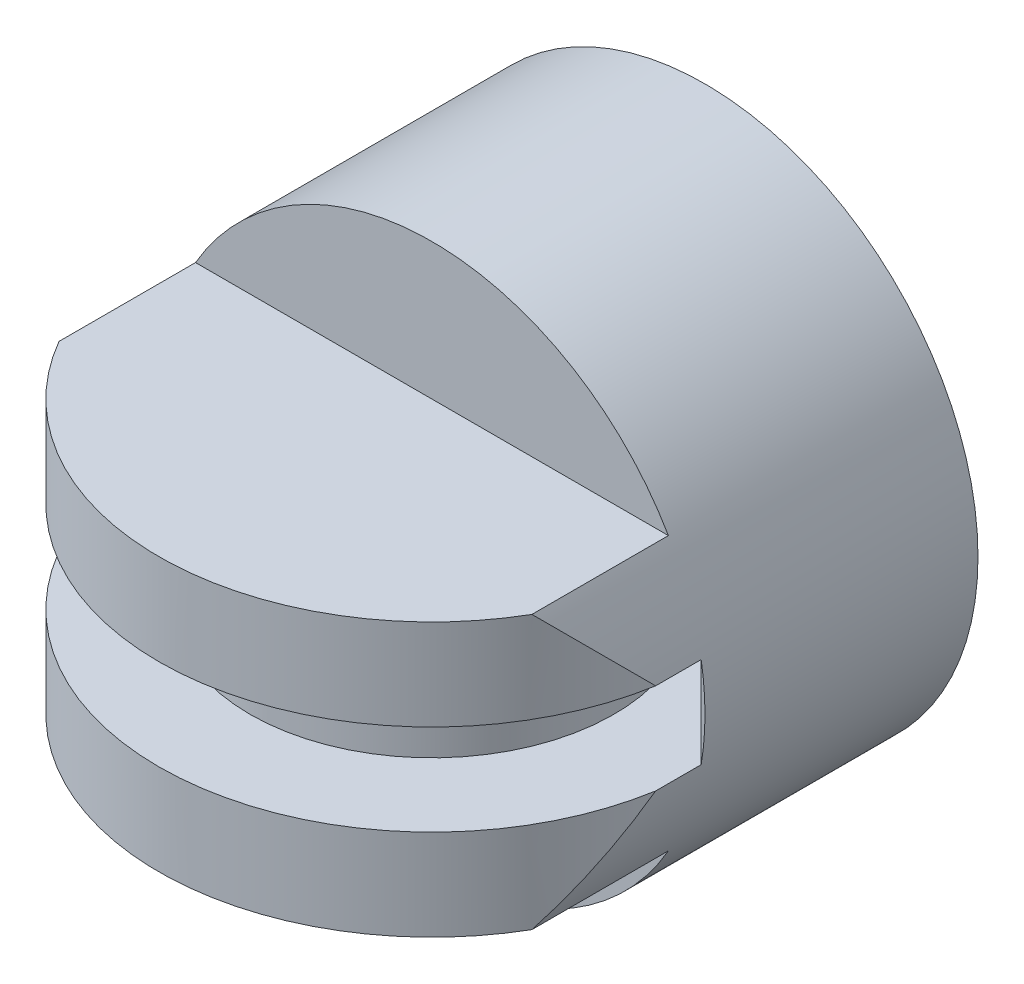
ISO-10303-21;
HEADER;
FILE_DESCRIPTION(('STEP AP214'),'2;1');
FILE_NAME('part.step','',(''),(''),'','','');
FILE_SCHEMA(('AUTOMOTIVE_DESIGN { 1 0 10303 214 1 1 1 1 }'));
ENDSEC;
DATA;
#1=APPLICATION_CONTEXT('core data for automotive mechanical design processes');
#2=APPLICATION_PROTOCOL_DEFINITION('international standard','automotive_design',2000,#1);
#3=PRODUCT_CONTEXT('',#1,'mechanical');
#4=PRODUCT('Part','Part','',(#3));
#5=PRODUCT_RELATED_PRODUCT_CATEGORY('part','',(#4));
#6=PRODUCT_DEFINITION_FORMATION('','',#4);
#7=PRODUCT_DEFINITION_CONTEXT('part definition',#1,'design');
#8=PRODUCT_DEFINITION('design','',#6,#7);
#9=PRODUCT_DEFINITION_SHAPE('','',#8);
#10=(LENGTH_UNIT() NAMED_UNIT(*) SI_UNIT(.MILLI.,.METRE.));
#11=(NAMED_UNIT(*) PLANE_ANGLE_UNIT() SI_UNIT($,.RADIAN.));
#12=(NAMED_UNIT(*) SI_UNIT($,.STERADIAN.) SOLID_ANGLE_UNIT());
#13=UNCERTAINTY_MEASURE_WITH_UNIT(LENGTH_MEASURE(1.E-05),#10,'distance_accuracy_value','');
#14=(GEOMETRIC_REPRESENTATION_CONTEXT(3) GLOBAL_UNCERTAINTY_ASSIGNED_CONTEXT((#13)) GLOBAL_UNIT_ASSIGNED_CONTEXT((#10,
#11,#12)) REPRESENTATION_CONTEXT('',''));
#15=CARTESIAN_POINT('',(0.,0.,0.));
#16=DIRECTION('',(0.,0.,1.));
#17=DIRECTION('',(1.,0.,0.));
#18=AXIS2_PLACEMENT_3D('',#15,#16,#17);
#19=CARTESIAN_POINT('',(0.,5.,0.));
#20=DIRECTION('',(0.,0.,1.));
#21=DIRECTION('',(1.,0.,0.));
#22=AXIS2_PLACEMENT_3D('',#19,#20,#21);
#23=PLANE('',#22);
#24=CARTESIAN_POINT('',(0.,5.,0.));
#25=DIRECTION('',(0.,0.,1.));
#26=DIRECTION('',(1.,0.,0.));
#27=AXIS2_PLACEMENT_3D('',#24,#25,#26);
#28=CIRCLE('',#27,30.);
#29=CARTESIAN_POINT('',(29.5803989154981,0.,0.));
#30=VERTEX_POINT('',#29);
#31=CARTESIAN_POINT('',(29.5803989154981,10.,0.));
#32=VERTEX_POINT('',#31);
#33=EDGE_CURVE('E129',#30,#32,#28,.T.);
#34=ORIENTED_EDGE('',*,*,#33,.T.);
#35=DIRECTION('',(0.,-1.,0.));
#36=VECTOR('',#35,1.);
#37=CARTESIAN_POINT('',(29.5803989154981,0.,0.));
#38=LINE('',#37,#36);
#39=EDGE_CURVE('E118',#32,#30,#38,.T.);
#40=ORIENTED_EDGE('',*,*,#39,.T.);
#41=EDGE_LOOP('',(#34,#40));
#42=FACE_BOUND('',#41,.T.);
#43=ADVANCED_FACE('F39',(#42),#23,.T.);
#44=CARTESIAN_POINT('',(-29.5803989154981,10.,2.06558821617994E-13));
#45=VERTEX_POINT('',#44);
#46=CARTESIAN_POINT('',(-29.5803989154981,0.,2.06558821617994E-13));
#47=VERTEX_POINT('',#46);
#48=EDGE_CURVE('E142',#45,#47,#28,.T.);
#49=ORIENTED_EDGE('',*,*,#48,.T.);
#50=DIRECTION('',(0.,-1.,0.));
#51=VECTOR('',#50,1.);
#52=CARTESIAN_POINT('',(-29.5803989154981,0.,2.06558821617994E-13));
#53=LINE('',#52,#51);
#54=EDGE_CURVE('E124',#45,#47,#53,.T.);
#55=ORIENTED_EDGE('',*,*,#54,.F.);
#56=EDGE_LOOP('',(#49,#55));
#57=FACE_BOUND('',#56,.T.);
#58=ADVANCED_FACE('F159',(#57),#23,.T.);
#59=CARTESIAN_POINT('',(0.,20.,0.));
#60=DIRECTION('',(0.,-1.,0.));
#61=DIRECTION('',(0.,0.,-1.));
#62=AXIS2_PLACEMENT_3D('',#59,#60,#61);
#63=CYLINDRICAL_SURFACE('',#62,30.);
#64=CARTESIAN_POINT('',(0.,5.,0.));
#65=DIRECTION('',(0.,-0.707106781186547,0.707106781186547));
#66=DIRECTION('',(0.,-0.707106781186547,-0.707106781186547));
#67=AXIS2_PLACEMENT_3D('',#64,#65,#66);
#68=ELLIPSE('',#67,42.4264068711928,30.);
#69=CARTESIAN_POINT('',(-29.5803989154981,10.,5.));
#70=VERTEX_POINT('',#69);
#71=CARTESIAN_POINT('',(-25.9807621135332,20.,15.));
#72=VERTEX_POINT('',#71);
#73=EDGE_CURVE('E59',#70,#72,#68,.F.);
#74=ORIENTED_EDGE('',*,*,#73,.F.);
#75=CARTESIAN_POINT('',(0.,10.,0.));
#76=DIRECTION('',(0.,1.,0.));
#77=DIRECTION('',(0.,0.,1.));
#78=AXIS2_PLACEMENT_3D('',#75,#76,#77);
#79=CIRCLE('',#78,30.);
#80=CARTESIAN_POINT('',(29.5803989154981,10.,5.));
#81=VERTEX_POINT('',#80);
#82=EDGE_CURVE('E176',#70,#81,#79,.T.);
#83=ORIENTED_EDGE('',*,*,#82,.T.);
#84=CARTESIAN_POINT('',(25.9807621135332,20.,15.));
#85=VERTEX_POINT('',#84);
#86=EDGE_CURVE('E131',#85,#81,#68,.F.);
#87=ORIENTED_EDGE('',*,*,#86,.F.);
#88=CARTESIAN_POINT('',(0.,20.,0.));
#89=DIRECTION('',(0.,1.,0.));
#90=DIRECTION('',(0.,0.,1.));
#91=AXIS2_PLACEMENT_3D('',#88,#89,#90);
#92=CIRCLE('',#91,30.);
#93=EDGE_CURVE('E170',#72,#85,#92,.T.);
#94=ORIENTED_EDGE('',*,*,#93,.F.);
#95=EDGE_LOOP('',(#74,#83,#87,#94));
#96=FACE_BOUND('',#95,.T.);
#97=ADVANCED_FACE('F223',(#96),#63,.T.);
#98=CARTESIAN_POINT('',(0.,20.,0.));
#99=DIRECTION('',(0.,1.,0.));
#100=DIRECTION('',(0.,0.,1.));
#101=AXIS2_PLACEMENT_3D('',#98,#99,#100);
#102=PLANE('',#101);
#103=DIRECTION('',(1.,0.,0.));
#104=VECTOR('',#103,1.);
#105=CARTESIAN_POINT('',(0.,20.,0.));
#106=LINE('',#105,#104);
#107=CARTESIAN_POINT('',(-25.9807621135332,20.,0.));
#108=VERTEX_POINT('',#107);
#109=CARTESIAN_POINT('',(25.9807621135332,20.,0.));
#110=VERTEX_POINT('',#109);
#111=EDGE_CURVE('E187',#108,#110,#106,.T.);
#112=ORIENTED_EDGE('',*,*,#111,.F.);
#113=DIRECTION('',(0.,0.,1.));
#114=VECTOR('',#113,1.);
#115=CARTESIAN_POINT('',(-25.9807621135332,20.,-30.));
#116=LINE('',#115,#114);
#117=EDGE_CURVE('E216',#108,#72,#116,.T.);
#118=ORIENTED_EDGE('',*,*,#117,.T.);
#119=ORIENTED_EDGE('',*,*,#93,.T.);
#120=DIRECTION('',(0.,0.,1.));
#121=VECTOR('',#120,1.);
#122=CARTESIAN_POINT('',(25.9807621135332,20.,-30.));
#123=LINE('',#122,#121);
#124=EDGE_CURVE('E213',#85,#110,#123,.F.);
#125=ORIENTED_EDGE('',*,*,#124,.T.);
#126=EDGE_LOOP('',(#112,#118,#119,#125));
#127=FACE_BOUND('',#126,.T.);
#128=ADVANCED_FACE('F221',(#127),#102,.T.);
#129=CARTESIAN_POINT('',(0.,10.,0.));
#130=DIRECTION('',(0.,1.,0.));
#131=DIRECTION('',(0.,0.,1.));
#132=AXIS2_PLACEMENT_3D('',#129,#130,#131);
#133=PLANE('',#132);
#134=CARTESIAN_POINT('',(0.,10.,0.));
#135=DIRECTION('',(0.,-1.,0.));
#136=DIRECTION('',(0.,0.,-1.));
#137=AXIS2_PLACEMENT_3D('',#134,#135,#136);
#138=CIRCLE('',#137,29.5803989154981);
#139=EDGE_CURVE('E102',#45,#32,#138,.T.);
#140=ORIENTED_EDGE('',*,*,#139,.T.);
#141=DIRECTION('',(0.,0.,1.));
#142=VECTOR('',#141,1.);
#143=CARTESIAN_POINT('',(29.5803989154981,10.,-30.));
#144=LINE('',#143,#142);
#145=EDGE_CURVE('E108',#81,#32,#144,.F.);
#146=ORIENTED_EDGE('',*,*,#145,.F.);
#147=ORIENTED_EDGE('',*,*,#82,.F.);
#148=DIRECTION('',(0.,0.,1.));
#149=VECTOR('',#148,1.);
#150=CARTESIAN_POINT('',(-29.5803989154981,10.,-30.));
#151=LINE('',#150,#149);
#152=EDGE_CURVE('E55',#45,#70,#151,.T.);
#153=ORIENTED_EDGE('',*,*,#152,.F.);
#154=EDGE_LOOP('',(#140,#146,#147,#153));
#155=FACE_BOUND('',#154,.T.);
#156=CARTESIAN_POINT('',(0.,10.,0.));
#157=DIRECTION('',(0.,1.,0.));
#158=DIRECTION('',(0.,0.,1.));
#159=AXIS2_PLACEMENT_3D('',#156,#157,#158);
#160=CIRCLE('',#159,20.);
#161=CARTESIAN_POINT('',(0.,10.,20.));
#162=VERTEX_POINT('',#161);
#163=EDGE_CURVE('E167',#162,#162,#160,.T.);
#164=ORIENTED_EDGE('',*,*,#163,.T.);
#165=EDGE_LOOP('',(#164));
#166=FACE_BOUND('',#165,.T.);
#167=ADVANCED_FACE('F104',(#155,#166),#133,.F.);
#168=CARTESIAN_POINT('',(0.,-10.,0.));
#169=DIRECTION('',(0.,1.,0.));
#170=DIRECTION('',(0.,0.,1.));
#171=AXIS2_PLACEMENT_3D('',#168,#169,#170);
#172=CYLINDRICAL_SURFACE('',#171,30.);
#173=CARTESIAN_POINT('',(0.,5.,0.));
#174=DIRECTION('',(0.,0.707106781186547,0.707106781186547));
#175=DIRECTION('',(0.,0.707106781186547,-0.707106781186547));
#176=AXIS2_PLACEMENT_3D('',#173,#174,#175);
#177=ELLIPSE('',#176,42.4264068711928,30.);
#178=CARTESIAN_POINT('',(29.5803989154981,0.,5.));
#179=VERTEX_POINT('',#178);
#180=CARTESIAN_POINT('',(25.9807621135332,-10.,15.));
#181=VERTEX_POINT('',#180);
#182=EDGE_CURVE('E133',#179,#181,#177,.F.);
#183=ORIENTED_EDGE('',*,*,#182,.F.);
#184=CARTESIAN_POINT('',(0.,0.,0.));
#185=DIRECTION('',(0.,-1.,0.));
#186=DIRECTION('',(0.,0.,-1.));
#187=AXIS2_PLACEMENT_3D('',#184,#185,#186);
#188=CIRCLE('',#187,30.);
#189=CARTESIAN_POINT('',(-29.5803989154981,0.,5.));
#190=VERTEX_POINT('',#189);
#191=EDGE_CURVE('E184',#179,#190,#188,.T.);
#192=ORIENTED_EDGE('',*,*,#191,.T.);
#193=CARTESIAN_POINT('',(-25.9807621135332,-10.,15.));
#194=VERTEX_POINT('',#193);
#195=EDGE_CURVE('E114',#194,#190,#177,.F.);
#196=ORIENTED_EDGE('',*,*,#195,.F.);
#197=CARTESIAN_POINT('',(0.,-10.,0.));
#198=DIRECTION('',(0.,-1.,0.));
#199=DIRECTION('',(0.,0.,-1.));
#200=AXIS2_PLACEMENT_3D('',#197,#198,#199);
#201=CIRCLE('',#200,30.);
#202=EDGE_CURVE('E177',#181,#194,#201,.T.);
#203=ORIENTED_EDGE('',*,*,#202,.F.);
#204=EDGE_LOOP('',(#183,#192,#196,#203));
#205=FACE_BOUND('',#204,.T.);
#206=ADVANCED_FACE('F258',(#205),#172,.T.);
#207=CARTESIAN_POINT('',(0.,-10.,0.));
#208=DIRECTION('',(0.,-1.,0.));
#209=DIRECTION('',(0.,0.,-1.));
#210=AXIS2_PLACEMENT_3D('',#207,#208,#209);
#211=PLANE('',#210);
#212=DIRECTION('',(-1.,0.,0.));
#213=VECTOR('',#212,1.);
#214=CARTESIAN_POINT('',(0.,-10.,0.));
#215=LINE('',#214,#213);
#216=CARTESIAN_POINT('',(25.9807621135332,-10.,0.));
#217=VERTEX_POINT('',#216);
#218=CARTESIAN_POINT('',(-25.9807621135332,-10.,0.));
#219=VERTEX_POINT('',#218);
#220=EDGE_CURVE('E156',#217,#219,#215,.T.);
#221=ORIENTED_EDGE('',*,*,#220,.F.);
#222=DIRECTION('',(0.,0.,1.));
#223=VECTOR('',#222,1.);
#224=CARTESIAN_POINT('',(25.9807621135332,-10.,-30.));
#225=LINE('',#224,#223);
#226=EDGE_CURVE('E201',#217,#181,#225,.T.);
#227=ORIENTED_EDGE('',*,*,#226,.T.);
#228=ORIENTED_EDGE('',*,*,#202,.T.);
#229=DIRECTION('',(0.,0.,1.));
#230=VECTOR('',#229,1.);
#231=CARTESIAN_POINT('',(-25.9807621135332,-10.,-30.));
#232=LINE('',#231,#230);
#233=EDGE_CURVE('E200',#194,#219,#232,.F.);
#234=ORIENTED_EDGE('',*,*,#233,.T.);
#235=EDGE_LOOP('',(#221,#227,#228,#234));
#236=FACE_BOUND('',#235,.T.);
#237=ADVANCED_FACE('F252',(#236),#211,.T.);
#238=CARTESIAN_POINT('',(0.,0.,0.));
#239=DIRECTION('',(0.,-1.,0.));
#240=DIRECTION('',(0.,0.,-1.));
#241=AXIS2_PLACEMENT_3D('',#238,#239,#240);
#242=PLANE('',#241);
#243=CARTESIAN_POINT('',(0.,0.,0.));
#244=DIRECTION('',(0.,1.,0.));
#245=DIRECTION('',(0.,0.,1.));
#246=AXIS2_PLACEMENT_3D('',#243,#244,#245);
#247=CIRCLE('',#246,20.);
#248=CARTESIAN_POINT('',(0.,0.,20.));
#249=VERTEX_POINT('',#248);
#250=EDGE_CURVE('E173',#249,#249,#247,.T.);
#251=ORIENTED_EDGE('',*,*,#250,.F.);
#252=EDGE_LOOP('',(#251));
#253=FACE_BOUND('',#252,.T.);
#254=DIRECTION('',(0.,0.,1.));
#255=VECTOR('',#254,1.);
#256=CARTESIAN_POINT('',(29.5803989154981,0.,-30.));
#257=LINE('',#256,#255);
#258=EDGE_CURVE('E11',#30,#179,#257,.T.);
#259=ORIENTED_EDGE('',*,*,#258,.F.);
#260=CARTESIAN_POINT('',(0.,0.,0.));
#261=DIRECTION('',(0.,-1.,0.));
#262=DIRECTION('',(0.,0.,-1.));
#263=AXIS2_PLACEMENT_3D('',#260,#261,#262);
#264=CIRCLE('',#263,29.5803989154981);
#265=EDGE_CURVE('E115',#47,#30,#264,.T.);
#266=ORIENTED_EDGE('',*,*,#265,.F.);
#267=DIRECTION('',(0.,0.,1.));
#268=VECTOR('',#267,1.);
#269=CARTESIAN_POINT('',(-29.5803989154981,0.,-30.));
#270=LINE('',#269,#268);
#271=EDGE_CURVE('E48',#190,#47,#270,.F.);
#272=ORIENTED_EDGE('',*,*,#271,.F.);
#273=ORIENTED_EDGE('',*,*,#191,.F.);
#274=EDGE_LOOP('',(#259,#266,#272,#273));
#275=FACE_BOUND('',#274,.T.);
#276=ADVANCED_FACE('F247',(#253,#275),#242,.F.);
#277=EDGE_CURVE('E138',#110,#108,#28,.T.);
#278=ORIENTED_EDGE('',*,*,#277,.T.);
#279=ORIENTED_EDGE('',*,*,#111,.T.);
#280=EDGE_LOOP('',(#278,#279));
#281=FACE_BOUND('',#280,.T.);
#282=ADVANCED_FACE('F231',(#281),#23,.T.);
#283=CARTESIAN_POINT('',(0.,5.,-30.));
#284=DIRECTION('',(0.,0.,1.));
#285=DIRECTION('',(1.,0.,0.));
#286=AXIS2_PLACEMENT_3D('',#283,#284,#285);
#287=CYLINDRICAL_SURFACE('',#286,30.);
#288=ORIENTED_EDGE('',*,*,#117,.F.);
#289=ORIENTED_EDGE('',*,*,#277,.F.);
#290=ORIENTED_EDGE('',*,*,#124,.F.);
#291=ORIENTED_EDGE('',*,*,#86,.T.);
#292=ORIENTED_EDGE('',*,*,#145,.T.);
#293=ORIENTED_EDGE('',*,*,#33,.F.);
#294=ORIENTED_EDGE('',*,*,#258,.T.);
#295=ORIENTED_EDGE('',*,*,#182,.T.);
#296=ORIENTED_EDGE('',*,*,#226,.F.);
#297=EDGE_CURVE('E136',#219,#217,#28,.T.);
#298=ORIENTED_EDGE('',*,*,#297,.F.);
#299=ORIENTED_EDGE('',*,*,#233,.F.);
#300=ORIENTED_EDGE('',*,*,#195,.T.);
#301=ORIENTED_EDGE('',*,*,#271,.T.);
#302=ORIENTED_EDGE('',*,*,#48,.F.);
#303=ORIENTED_EDGE('',*,*,#152,.T.);
#304=ORIENTED_EDGE('',*,*,#73,.T.);
#305=EDGE_LOOP('',(#288,#289,#290,#291,#292,#293,#294,#295,#296,#298,#299,#300,#301,#302,#303,#304));
#306=FACE_BOUND('',#305,.T.);
#307=CARTESIAN_POINT('',(0.,5.,-30.));
#308=DIRECTION('',(0.,0.,1.));
#309=DIRECTION('',(1.,0.,0.));
#310=AXIS2_PLACEMENT_3D('',#307,#308,#309);
#311=CIRCLE('',#310,30.);
#312=CARTESIAN_POINT('',(30.,5.,-30.));
#313=VERTEX_POINT('',#312);
#314=EDGE_CURVE('E148',#313,#313,#311,.T.);
#315=ORIENTED_EDGE('',*,*,#314,.T.);
#316=EDGE_LOOP('',(#315));
#317=FACE_BOUND('',#316,.T.);
#318=ADVANCED_FACE('F127',(#306,#317),#287,.T.);
#319=CARTESIAN_POINT('',(0.,5.,-30.));
#320=DIRECTION('',(0.,0.,1.));
#321=DIRECTION('',(1.,0.,0.));
#322=AXIS2_PLACEMENT_3D('',#319,#320,#321);
#323=PLANE('',#322);
#324=ORIENTED_EDGE('',*,*,#314,.F.);
#325=EDGE_LOOP('',(#324));
#326=FACE_BOUND('',#325,.T.);
#327=ADVANCED_FACE('F239',(#326),#323,.F.);
#328=ORIENTED_EDGE('',*,*,#297,.T.);
#329=ORIENTED_EDGE('',*,*,#220,.T.);
#330=EDGE_LOOP('',(#328,#329));
#331=FACE_BOUND('',#330,.T.);
#332=ADVANCED_FACE('F197',(#331),#23,.T.);
#333=CARTESIAN_POINT('',(0.,10.,0.));
#334=DIRECTION('',(0.,-1.,0.));
#335=DIRECTION('',(0.,0.,-1.));
#336=AXIS2_PLACEMENT_3D('',#333,#334,#335);
#337=CYLINDRICAL_SURFACE('',#336,20.);
#338=ORIENTED_EDGE('',*,*,#250,.T.);
#339=EDGE_LOOP('',(#338));
#340=FACE_BOUND('',#339,.T.);
#341=ORIENTED_EDGE('',*,*,#163,.F.);
#342=EDGE_LOOP('',(#341));
#343=FACE_BOUND('',#342,.T.);
#344=ADVANCED_FACE('F41',(#340,#343),#337,.T.);
#345=CARTESIAN_POINT('',(0.,0.,0.));
#346=DIRECTION('',(0.,-1.,0.));
#347=DIRECTION('',(0.,0.,-1.));
#348=AXIS2_PLACEMENT_3D('',#345,#346,#347);
#349=CYLINDRICAL_SURFACE('',#348,29.5803989154981);
#350=ORIENTED_EDGE('',*,*,#139,.F.);
#351=ORIENTED_EDGE('',*,*,#54,.T.);
#352=ORIENTED_EDGE('',*,*,#265,.T.);
#353=ORIENTED_EDGE('',*,*,#39,.F.);
#354=EDGE_LOOP('',(#350,#351,#352,#353));
#355=FACE_BOUND('',#354,.T.);
#356=ADVANCED_FACE('F119',(#355),#349,.F.);
#357=CLOSED_SHELL('',(#43,#58,#97,#128,#167,#206,#237,#276,#282,#318,#327,#332,#344,#356));
#358=MANIFOLD_SOLID_BREP('B2',#357);
#359=ADVANCED_BREP_SHAPE_REPRESENTATION('',(#18,#358),#14);
#360=SHAPE_DEFINITION_REPRESENTATION(#9,#359);
ENDSEC;
END-ISO-10303-21;
